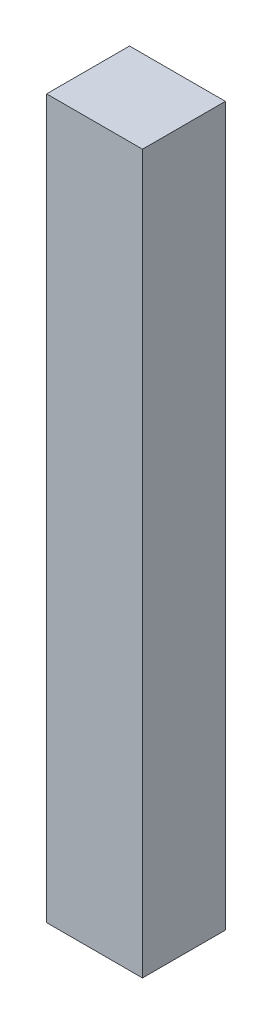
ISO-10303-21;
HEADER;
FILE_DESCRIPTION(('STEP AP214'),'2;1');
FILE_NAME('part.step','',(''),(''),'','','');
FILE_SCHEMA(('AUTOMOTIVE_DESIGN { 1 0 10303 214 1 1 1 1 }'));
ENDSEC;
DATA;
#1=APPLICATION_CONTEXT('core data for automotive mechanical design processes');
#2=APPLICATION_PROTOCOL_DEFINITION('international standard','automotive_design',2000,#1);
#3=PRODUCT_CONTEXT('',#1,'mechanical');
#4=PRODUCT('Part','Part','',(#3));
#5=PRODUCT_RELATED_PRODUCT_CATEGORY('part','',(#4));
#6=PRODUCT_DEFINITION_FORMATION('','',#4);
#7=PRODUCT_DEFINITION_CONTEXT('part definition',#1,'design');
#8=PRODUCT_DEFINITION('design','',#6,#7);
#9=PRODUCT_DEFINITION_SHAPE('','',#8);
#10=(LENGTH_UNIT() NAMED_UNIT(*) SI_UNIT(.MILLI.,.METRE.));
#11=(NAMED_UNIT(*) PLANE_ANGLE_UNIT() SI_UNIT($,.RADIAN.));
#12=(NAMED_UNIT(*) SI_UNIT($,.STERADIAN.) SOLID_ANGLE_UNIT());
#13=UNCERTAINTY_MEASURE_WITH_UNIT(LENGTH_MEASURE(1.E-05),#10,'distance_accuracy_value','');
#14=(GEOMETRIC_REPRESENTATION_CONTEXT(3) GLOBAL_UNCERTAINTY_ASSIGNED_CONTEXT((#13)) GLOBAL_UNIT_ASSIGNED_CONTEXT((#10,
#11,#12)) REPRESENTATION_CONTEXT('',''));
#15=CARTESIAN_POINT('',(0.,0.,0.));
#16=DIRECTION('',(0.,0.,1.));
#17=DIRECTION('',(1.,0.,0.));
#18=AXIS2_PLACEMENT_3D('',#15,#16,#17);
#19=CARTESIAN_POINT('',(-16.8546781685468,-43.6114797611148,8.382));
#20=DIRECTION('',(0.,1.,0.));
#21=DIRECTION('',(0.,0.,1.));
#22=AXIS2_PLACEMENT_3D('',#19,#20,#21);
#23=PLANE('',#22);
#24=DIRECTION('',(1.,0.,0.));
#25=VECTOR('',#24,1.);
#26=CARTESIAN_POINT('',(-16.8546781685468,-43.6114797611148,0.));
#27=LINE('',#26,#25);
#28=CARTESIAN_POINT('',(-16.8546781685468,-43.6114797611148,0.));
#29=VERTEX_POINT('',#28);
#30=CARTESIAN_POINT('',(-7.1632382216324,-43.6114797611148,0.));
#31=VERTEX_POINT('',#30);
#32=EDGE_CURVE('E95',#29,#31,#27,.T.);
#33=ORIENTED_EDGE('',*,*,#32,.T.);
#34=DIRECTION('',(0.,0.,-1.));
#35=VECTOR('',#34,1.);
#36=CARTESIAN_POINT('',(-7.1632382216324,-43.6114797611148,8.382));
#37=LINE('',#36,#35);
#38=CARTESIAN_POINT('',(-7.1632382216324,-43.6114797611148,8.382));
#39=VERTEX_POINT('',#38);
#40=EDGE_CURVE('E11',#39,#31,#37,.T.);
#41=ORIENTED_EDGE('',*,*,#40,.F.);
#42=DIRECTION('',(1.,0.,0.));
#43=VECTOR('',#42,1.);
#44=CARTESIAN_POINT('',(-16.8546781685468,-43.6114797611148,8.382));
#45=LINE('',#44,#43);
#46=CARTESIAN_POINT('',(-16.8546781685468,-43.6114797611148,8.382));
#47=VERTEX_POINT('',#46);
#48=EDGE_CURVE('E81',#47,#39,#45,.T.);
#49=ORIENTED_EDGE('',*,*,#48,.F.);
#50=DIRECTION('',(0.,0.,-1.));
#51=VECTOR('',#50,1.);
#52=CARTESIAN_POINT('',(-16.8546781685468,-43.6114797611148,8.382));
#53=LINE('',#52,#51);
#54=EDGE_CURVE('E48',#47,#29,#53,.T.);
#55=ORIENTED_EDGE('',*,*,#54,.T.);
#56=EDGE_LOOP('',(#33,#41,#49,#55));
#57=FACE_BOUND('',#56,.T.);
#58=ADVANCED_FACE('F32',(#57),#23,.F.);
#59=CARTESIAN_POINT('',(-7.1632382216324,-43.6114797611148,8.382));
#60=DIRECTION('',(-1.,0.,0.));
#61=DIRECTION('',(0.,0.,1.));
#62=AXIS2_PLACEMENT_3D('',#59,#60,#61);
#63=PLANE('',#62);
#64=DIRECTION('',(0.,1.,0.));
#65=VECTOR('',#64,1.);
#66=CARTESIAN_POINT('',(-7.1632382216324,-43.6114797611148,0.));
#67=LINE('',#66,#65);
#68=CARTESIAN_POINT('',(-7.1632382216324,28.9669832778827,0.));
#69=VERTEX_POINT('',#68);
#70=EDGE_CURVE('E86',#31,#69,#67,.T.);
#71=ORIENTED_EDGE('',*,*,#70,.T.);
#72=DIRECTION('',(0.,0.,-1.));
#73=VECTOR('',#72,1.);
#74=CARTESIAN_POINT('',(-7.1632382216324,28.9669832778827,8.382));
#75=LINE('',#74,#73);
#76=CARTESIAN_POINT('',(-7.1632382216324,28.9669832778827,8.382));
#77=VERTEX_POINT('',#76);
#78=EDGE_CURVE('E40',#77,#69,#75,.T.);
#79=ORIENTED_EDGE('',*,*,#78,.F.);
#80=DIRECTION('',(0.,1.,0.));
#81=VECTOR('',#80,1.);
#82=CARTESIAN_POINT('',(-7.1632382216324,-43.6114797611148,8.382));
#83=LINE('',#82,#81);
#84=EDGE_CURVE('E73',#39,#77,#83,.T.);
#85=ORIENTED_EDGE('',*,*,#84,.F.);
#86=ORIENTED_EDGE('',*,*,#40,.T.);
#87=EDGE_LOOP('',(#71,#79,#85,#86));
#88=FACE_BOUND('',#87,.T.);
#89=ADVANCED_FACE('F85',(#88),#63,.F.);
#90=CARTESIAN_POINT('',(-16.8546781685468,28.9669832778827,8.382));
#91=DIRECTION('',(0.,1.,0.));
#92=DIRECTION('',(0.,0.,1.));
#93=AXIS2_PLACEMENT_3D('',#90,#91,#92);
#94=PLANE('',#93);
#95=DIRECTION('',(1.,0.,0.));
#96=VECTOR('',#95,1.);
#97=CARTESIAN_POINT('',(-16.8546781685468,28.9669832778827,0.));
#98=LINE('',#97,#96);
#99=CARTESIAN_POINT('',(-16.8546781685468,28.9669832778827,0.));
#100=VERTEX_POINT('',#99);
#101=EDGE_CURVE('E98',#100,#69,#98,.T.);
#102=ORIENTED_EDGE('',*,*,#101,.F.);
#103=DIRECTION('',(0.,0.,-1.));
#104=VECTOR('',#103,1.);
#105=CARTESIAN_POINT('',(-16.8546781685468,28.9669832778827,8.382));
#106=LINE('',#105,#104);
#107=CARTESIAN_POINT('',(-16.8546781685468,28.9669832778827,8.382));
#108=VERTEX_POINT('',#107);
#109=EDGE_CURVE('E62',#108,#100,#106,.T.);
#110=ORIENTED_EDGE('',*,*,#109,.F.);
#111=DIRECTION('',(1.,0.,0.));
#112=VECTOR('',#111,1.);
#113=CARTESIAN_POINT('',(-16.8546781685468,28.9669832778827,8.382));
#114=LINE('',#113,#112);
#115=EDGE_CURVE('E80',#108,#77,#114,.T.);
#116=ORIENTED_EDGE('',*,*,#115,.T.);
#117=ORIENTED_EDGE('',*,*,#78,.T.);
#118=EDGE_LOOP('',(#102,#110,#116,#117));
#119=FACE_BOUND('',#118,.T.);
#120=ADVANCED_FACE('F89',(#119),#94,.T.);
#121=CARTESIAN_POINT('',(-16.8546781685468,-43.6114797611148,8.382));
#122=DIRECTION('',(-1.,0.,0.));
#123=DIRECTION('',(0.,0.,1.));
#124=AXIS2_PLACEMENT_3D('',#121,#122,#123);
#125=PLANE('',#124);
#126=DIRECTION('',(0.,1.,0.));
#127=VECTOR('',#126,1.);
#128=CARTESIAN_POINT('',(-16.8546781685468,-43.6114797611148,0.));
#129=LINE('',#128,#127);
#130=EDGE_CURVE('E100',#29,#100,#129,.T.);
#131=ORIENTED_EDGE('',*,*,#130,.F.);
#132=ORIENTED_EDGE('',*,*,#54,.F.);
#133=DIRECTION('',(0.,1.,0.));
#134=VECTOR('',#133,1.);
#135=CARTESIAN_POINT('',(-16.8546781685468,-43.6114797611148,8.382));
#136=LINE('',#135,#134);
#137=EDGE_CURVE('E90',#47,#108,#136,.T.);
#138=ORIENTED_EDGE('',*,*,#137,.T.);
#139=ORIENTED_EDGE('',*,*,#109,.T.);
#140=EDGE_LOOP('',(#131,#132,#138,#139));
#141=FACE_BOUND('',#140,.T.);
#142=ADVANCED_FACE('F106',(#141),#125,.T.);
#143=CARTESIAN_POINT('',(0.,0.,8.382));
#144=DIRECTION('',(0.,0.,1.));
#145=DIRECTION('',(1.,0.,0.));
#146=AXIS2_PLACEMENT_3D('',#143,#144,#145);
#147=PLANE('',#146);
#148=ORIENTED_EDGE('',*,*,#48,.T.);
#149=ORIENTED_EDGE('',*,*,#84,.T.);
#150=ORIENTED_EDGE('',*,*,#115,.F.);
#151=ORIENTED_EDGE('',*,*,#137,.F.);
#152=EDGE_LOOP('',(#148,#149,#150,#151));
#153=FACE_BOUND('',#152,.T.);
#154=ADVANCED_FACE('F77',(#153),#147,.T.);
#155=CARTESIAN_POINT('',(0.,0.,0.));
#156=DIRECTION('',(0.,0.,1.));
#157=DIRECTION('',(1.,0.,0.));
#158=AXIS2_PLACEMENT_3D('',#155,#156,#157);
#159=PLANE('',#158);
#160=ORIENTED_EDGE('',*,*,#32,.F.);
#161=ORIENTED_EDGE('',*,*,#130,.T.);
#162=ORIENTED_EDGE('',*,*,#101,.T.);
#163=ORIENTED_EDGE('',*,*,#70,.F.);
#164=EDGE_LOOP('',(#160,#161,#162,#163));
#165=FACE_BOUND('',#164,.T.);
#166=ADVANCED_FACE('F105',(#165),#159,.F.);
#167=CLOSED_SHELL('',(#58,#89,#120,#142,#154,#166));
#168=MANIFOLD_SOLID_BREP('B2',#167);
#169=ADVANCED_BREP_SHAPE_REPRESENTATION('',(#18,#168),#14);
#170=SHAPE_DEFINITION_REPRESENTATION(#9,#169);
ENDSEC;
END-ISO-10303-21;
